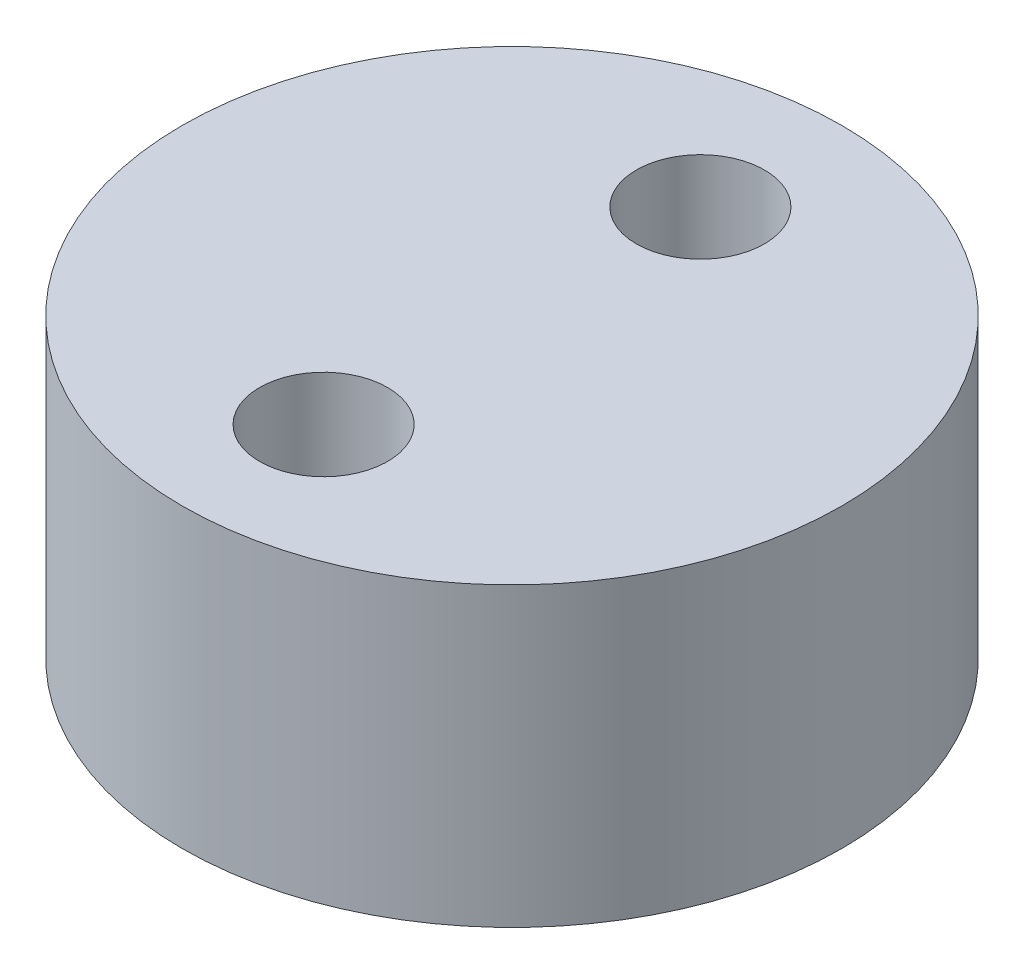
ISO-10303-21;
HEADER;
FILE_DESCRIPTION(('STEP AP214'),'2;1');
FILE_NAME('part.step','',(''),(''),'','','');
FILE_SCHEMA(('AUTOMOTIVE_DESIGN { 1 0 10303 214 1 1 1 1 }'));
ENDSEC;
DATA;
#1=APPLICATION_CONTEXT('core data for automotive mechanical design processes');
#2=APPLICATION_PROTOCOL_DEFINITION('international standard','automotive_design',2000,#1);
#3=PRODUCT_CONTEXT('',#1,'mechanical');
#4=PRODUCT('Part','Part','',(#3));
#5=PRODUCT_RELATED_PRODUCT_CATEGORY('part','',(#4));
#6=PRODUCT_DEFINITION_FORMATION('','',#4);
#7=PRODUCT_DEFINITION_CONTEXT('part definition',#1,'design');
#8=PRODUCT_DEFINITION('design','',#6,#7);
#9=PRODUCT_DEFINITION_SHAPE('','',#8);
#10=(LENGTH_UNIT() NAMED_UNIT(*) SI_UNIT(.MILLI.,.METRE.));
#11=(NAMED_UNIT(*) PLANE_ANGLE_UNIT() SI_UNIT($,.RADIAN.));
#12=(NAMED_UNIT(*) SI_UNIT($,.STERADIAN.) SOLID_ANGLE_UNIT());
#13=UNCERTAINTY_MEASURE_WITH_UNIT(LENGTH_MEASURE(1.E-05),#10,'distance_accuracy_value','');
#14=(GEOMETRIC_REPRESENTATION_CONTEXT(3) GLOBAL_UNCERTAINTY_ASSIGNED_CONTEXT((#13)) GLOBAL_UNIT_ASSIGNED_CONTEXT((#10,
#11,#12)) REPRESENTATION_CONTEXT('',''));
#15=CARTESIAN_POINT('',(0.,0.,0.));
#16=DIRECTION('',(0.,0.,1.));
#17=DIRECTION('',(1.,0.,0.));
#18=AXIS2_PLACEMENT_3D('',#15,#16,#17);
#19=CARTESIAN_POINT('',(0.,10.,0.));
#20=DIRECTION('',(0.,1.,0.));
#21=DIRECTION('',(0.,0.,1.));
#22=AXIS2_PLACEMENT_3D('',#19,#20,#21);
#23=PLANE('',#22);
#24=CARTESIAN_POINT('',(0.,10.,-6.35));
#25=DIRECTION('',(0.,1.,0.));
#26=DIRECTION('',(0.,0.,1.));
#27=AXIS2_PLACEMENT_3D('',#24,#25,#26);
#28=CIRCLE('',#27,2.159);
#29=CARTESIAN_POINT('',(0.,10.,-4.191));
#30=VERTEX_POINT('',#29);
#31=EDGE_CURVE('E42',#30,#30,#28,.T.);
#32=ORIENTED_EDGE('',*,*,#31,.F.);
#33=EDGE_LOOP('',(#32));
#34=FACE_BOUND('',#33,.T.);
#35=CARTESIAN_POINT('',(0.,10.,0.));
#36=DIRECTION('',(0.,1.,0.));
#37=DIRECTION('',(0.,0.,1.));
#38=AXIS2_PLACEMENT_3D('',#35,#36,#37);
#39=CIRCLE('',#38,11.1125);
#40=CARTESIAN_POINT('',(0.,10.,11.1125));
#41=VERTEX_POINT('',#40);
#42=EDGE_CURVE('E10',#41,#41,#39,.T.);
#43=ORIENTED_EDGE('',*,*,#42,.T.);
#44=EDGE_LOOP('',(#43));
#45=FACE_BOUND('',#44,.T.);
#46=CARTESIAN_POINT('',(0.,10.,6.35));
#47=DIRECTION('',(0.,1.,0.));
#48=DIRECTION('',(0.,0.,-1.));
#49=AXIS2_PLACEMENT_3D('',#46,#47,#48);
#50=CIRCLE('',#49,2.159);
#51=CARTESIAN_POINT('',(0.,10.,4.191));
#52=VERTEX_POINT('',#51);
#53=EDGE_CURVE('E47',#52,#52,#50,.T.);
#54=ORIENTED_EDGE('',*,*,#53,.F.);
#55=EDGE_LOOP('',(#54));
#56=FACE_BOUND('',#55,.T.);
#57=ADVANCED_FACE('F31',(#34,#45,#56),#23,.T.);
#58=CARTESIAN_POINT('',(0.,0.,0.));
#59=DIRECTION('',(0.,1.,0.));
#60=DIRECTION('',(0.,0.,1.));
#61=AXIS2_PLACEMENT_3D('',#58,#59,#60);
#62=PLANE('',#61);
#63=CARTESIAN_POINT('',(0.,0.,0.));
#64=DIRECTION('',(0.,1.,0.));
#65=DIRECTION('',(0.,0.,1.));
#66=AXIS2_PLACEMENT_3D('',#63,#64,#65);
#67=CIRCLE('',#66,11.1125);
#68=CARTESIAN_POINT('',(0.,0.,11.1125));
#69=VERTEX_POINT('',#68);
#70=EDGE_CURVE('E35',#69,#69,#67,.T.);
#71=ORIENTED_EDGE('',*,*,#70,.F.);
#72=EDGE_LOOP('',(#71));
#73=FACE_BOUND('',#72,.T.);
#74=CARTESIAN_POINT('',(0.,0.,-6.35));
#75=DIRECTION('',(0.,1.,0.));
#76=DIRECTION('',(0.,0.,1.));
#77=AXIS2_PLACEMENT_3D('',#74,#75,#76);
#78=CIRCLE('',#77,2.159);
#79=CARTESIAN_POINT('',(0.,0.,-4.191));
#80=VERTEX_POINT('',#79);
#81=EDGE_CURVE('E44',#80,#80,#78,.T.);
#82=ORIENTED_EDGE('',*,*,#81,.T.);
#83=EDGE_LOOP('',(#82));
#84=FACE_BOUND('',#83,.T.);
#85=CARTESIAN_POINT('',(0.,0.,6.35));
#86=DIRECTION('',(0.,1.,0.));
#87=DIRECTION('',(0.,0.,-1.));
#88=AXIS2_PLACEMENT_3D('',#85,#86,#87);
#89=CIRCLE('',#88,2.159);
#90=CARTESIAN_POINT('',(0.,0.,4.191));
#91=VERTEX_POINT('',#90);
#92=EDGE_CURVE('E50',#91,#91,#89,.T.);
#93=ORIENTED_EDGE('',*,*,#92,.T.);
#94=EDGE_LOOP('',(#93));
#95=FACE_BOUND('',#94,.T.);
#96=ADVANCED_FACE('F60',(#73,#84,#95),#62,.F.);
#97=CARTESIAN_POINT('',(0.,10.,0.));
#98=DIRECTION('',(0.,-1.,0.));
#99=DIRECTION('',(0.,0.,-1.));
#100=AXIS2_PLACEMENT_3D('',#97,#98,#99);
#101=CYLINDRICAL_SURFACE('',#100,11.1125);
#102=ORIENTED_EDGE('',*,*,#42,.F.);
#103=EDGE_LOOP('',(#102));
#104=FACE_BOUND('',#103,.T.);
#105=ORIENTED_EDGE('',*,*,#70,.T.);
#106=EDGE_LOOP('',(#105));
#107=FACE_BOUND('',#106,.T.);
#108=ADVANCED_FACE('F33',(#104,#107),#101,.T.);
#109=CARTESIAN_POINT('',(0.,10.,-6.35));
#110=DIRECTION('',(0.,-1.,0.));
#111=DIRECTION('',(0.,0.,-1.));
#112=AXIS2_PLACEMENT_3D('',#109,#110,#111);
#113=CYLINDRICAL_SURFACE('',#112,2.159);
#114=ORIENTED_EDGE('',*,*,#31,.T.);
#115=EDGE_LOOP('',(#114));
#116=FACE_BOUND('',#115,.T.);
#117=ORIENTED_EDGE('',*,*,#81,.F.);
#118=EDGE_LOOP('',(#117));
#119=FACE_BOUND('',#118,.T.);
#120=ADVANCED_FACE('F69',(#116,#119),#113,.F.);
#121=CARTESIAN_POINT('',(0.,10.,6.35));
#122=DIRECTION('',(0.,-1.,0.));
#123=DIRECTION('',(0.,0.,-1.));
#124=AXIS2_PLACEMENT_3D('',#121,#122,#123);
#125=CYLINDRICAL_SURFACE('',#124,2.159);
#126=ORIENTED_EDGE('',*,*,#53,.T.);
#127=EDGE_LOOP('',(#126));
#128=FACE_BOUND('',#127,.T.);
#129=ORIENTED_EDGE('',*,*,#92,.F.);
#130=EDGE_LOOP('',(#129));
#131=FACE_BOUND('',#130,.T.);
#132=ADVANCED_FACE('F56',(#128,#131),#125,.F.);
#133=CLOSED_SHELL('',(#57,#96,#108,#120,#132));
#134=MANIFOLD_SOLID_BREP('B2',#133);
#135=ADVANCED_BREP_SHAPE_REPRESENTATION('',(#18,#134),#14);
#136=SHAPE_DEFINITION_REPRESENTATION(#9,#135);
ENDSEC;
END-ISO-10303-21;
